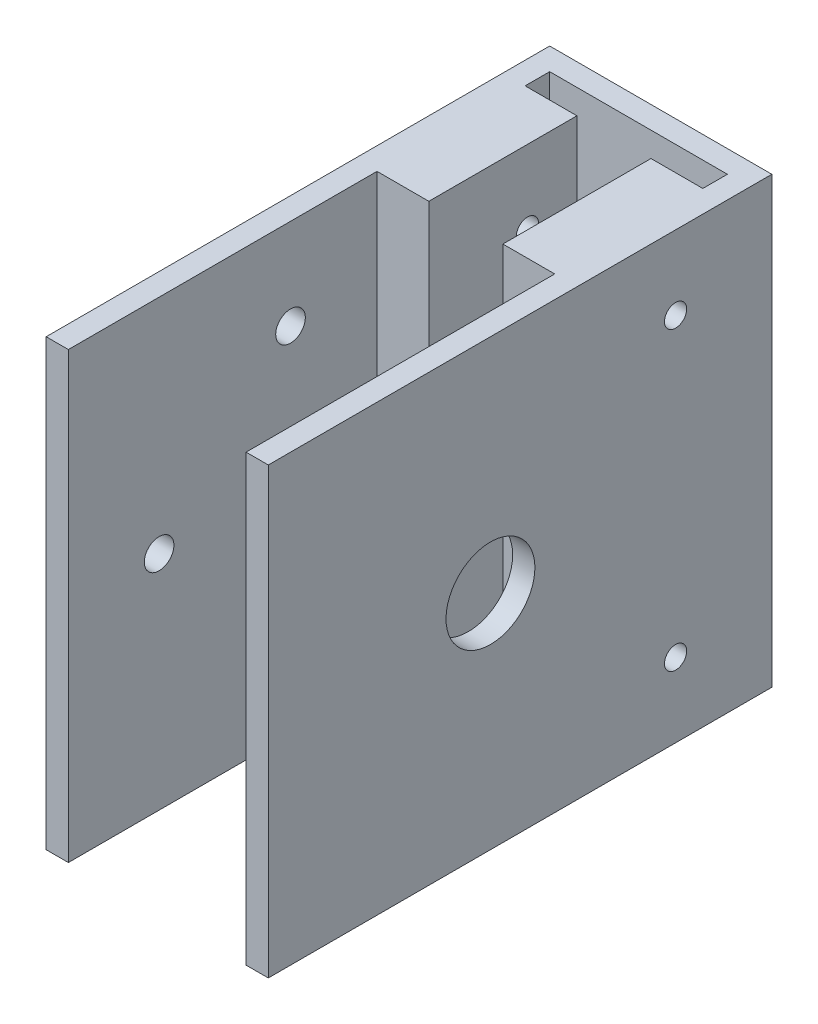
ISO-10303-21;
HEADER;
FILE_DESCRIPTION(('STEP AP214'),'2;1');
FILE_NAME('part.step','',(''),(''),'','','');
FILE_SCHEMA(('AUTOMOTIVE_DESIGN { 1 0 10303 214 1 1 1 1 }'));
ENDSEC;
DATA;
#1=APPLICATION_CONTEXT('core data for automotive mechanical design processes');
#2=APPLICATION_PROTOCOL_DEFINITION('international standard','automotive_design',2000,#1);
#3=PRODUCT_CONTEXT('',#1,'mechanical');
#4=PRODUCT('Part','Part','',(#3));
#5=PRODUCT_RELATED_PRODUCT_CATEGORY('part','',(#4));
#6=PRODUCT_DEFINITION_FORMATION('','',#4);
#7=PRODUCT_DEFINITION_CONTEXT('part definition',#1,'design');
#8=PRODUCT_DEFINITION('design','',#6,#7);
#9=PRODUCT_DEFINITION_SHAPE('','',#8);
#10=(LENGTH_UNIT() NAMED_UNIT(*) SI_UNIT(.MILLI.,.METRE.));
#11=(NAMED_UNIT(*) PLANE_ANGLE_UNIT() SI_UNIT($,.RADIAN.));
#12=(NAMED_UNIT(*) SI_UNIT($,.STERADIAN.) SOLID_ANGLE_UNIT());
#13=UNCERTAINTY_MEASURE_WITH_UNIT(LENGTH_MEASURE(1.E-05),#10,'distance_accuracy_value','');
#14=(GEOMETRIC_REPRESENTATION_CONTEXT(3) GLOBAL_UNCERTAINTY_ASSIGNED_CONTEXT((#13)) GLOBAL_UNIT_ASSIGNED_CONTEXT((#10,
#11,#12)) REPRESENTATION_CONTEXT('',''));
#15=CARTESIAN_POINT('',(0.,0.,0.));
#16=DIRECTION('',(0.,0.,1.));
#17=DIRECTION('',(1.,0.,0.));
#18=AXIS2_PLACEMENT_3D('',#15,#16,#17);
#19=CARTESIAN_POINT('',(-12.,30.,68.));
#20=DIRECTION('',(-1.,0.,0.));
#21=DIRECTION('',(0.,-1.,0.));
#22=AXIS2_PLACEMENT_3D('',#19,#20,#21);
#23=PLANE('',#22);
#24=DIRECTION('',(0.,1.,0.));
#25=VECTOR('',#24,1.);
#26=CARTESIAN_POINT('',(-12.,-51.1896201004171,6.32013899553956));
#27=LINE('',#26,#25);
#28=CARTESIAN_POINT('',(-12.,-30.,6.32013899553956));
#29=VERTEX_POINT('',#28);
#30=CARTESIAN_POINT('',(-12.,30.,6.32013899553956));
#31=VERTEX_POINT('',#30);
#32=EDGE_CURVE('E163',#29,#31,#27,.T.);
#33=ORIENTED_EDGE('',*,*,#32,.F.);
#34=DIRECTION('',(0.,0.,-1.));
#35=VECTOR('',#34,1.);
#36=CARTESIAN_POINT('',(-12.,-30.,68.));
#37=LINE('',#36,#35);
#38=CARTESIAN_POINT('',(-12.,-30.,3.));
#39=VERTEX_POINT('',#38);
#40=EDGE_CURVE('E251',#29,#39,#37,.T.);
#41=ORIENTED_EDGE('',*,*,#40,.T.);
#42=DIRECTION('',(0.,1.,0.));
#43=VECTOR('',#42,1.);
#44=CARTESIAN_POINT('',(-12.,30.,3.));
#45=LINE('',#44,#43);
#46=CARTESIAN_POINT('',(-12.,30.,3.));
#47=VERTEX_POINT('',#46);
#48=EDGE_CURVE('E237',#39,#47,#45,.T.);
#49=ORIENTED_EDGE('',*,*,#48,.T.);
#50=DIRECTION('',(0.,0.,-1.));
#51=VECTOR('',#50,1.);
#52=CARTESIAN_POINT('',(-12.,30.,68.));
#53=LINE('',#52,#51);
#54=EDGE_CURVE('E60',#31,#47,#53,.T.);
#55=ORIENTED_EDGE('',*,*,#54,.F.);
#56=EDGE_LOOP('',(#33,#41,#49,#55));
#57=FACE_BOUND('',#56,.T.);
#58=ADVANCED_FACE('F37',(#57),#23,.F.);
#59=CARTESIAN_POINT('',(12.,30.,68.));
#60=DIRECTION('',(1.,0.,0.));
#61=DIRECTION('',(0.,1.,0.));
#62=AXIS2_PLACEMENT_3D('',#59,#60,#61);
#63=PLANE('',#62);
#64=CARTESIAN_POINT('',(12.,0.,38.));
#65=DIRECTION('',(1.,0.,0.));
#66=DIRECTION('',(0.,1.,0.));
#67=AXIS2_PLACEMENT_3D('',#64,#65,#66);
#68=CIRCLE('',#67,6.00000000000001);
#69=CARTESIAN_POINT('',(12.,6.00000000000001,38.));
#70=VERTEX_POINT('',#69);
#71=EDGE_CURVE('E348',#70,#70,#68,.T.);
#72=ORIENTED_EDGE('',*,*,#71,.T.);
#73=EDGE_LOOP('',(#72));
#74=FACE_BOUND('',#73,.T.);
#75=DIRECTION('',(0.,1.,0.));
#76=VECTOR('',#75,1.);
#77=CARTESIAN_POINT('',(12.,-51.1896201004171,26.3201389955396));
#78=LINE('',#77,#76);
#79=CARTESIAN_POINT('',(12.,-30.,26.3201389955396));
#80=VERTEX_POINT('',#79);
#81=CARTESIAN_POINT('',(12.,30.,26.3201389955396));
#82=VERTEX_POINT('',#81);
#83=EDGE_CURVE('E210',#80,#82,#78,.T.);
#84=ORIENTED_EDGE('',*,*,#83,.F.);
#85=DIRECTION('',(0.,0.,-1.));
#86=VECTOR('',#85,1.);
#87=CARTESIAN_POINT('',(12.,-30.,68.));
#88=LINE('',#87,#86);
#89=CARTESIAN_POINT('',(12.,-30.,68.));
#90=VERTEX_POINT('',#89);
#91=EDGE_CURVE('E230',#90,#80,#88,.T.);
#92=ORIENTED_EDGE('',*,*,#91,.F.);
#93=DIRECTION('',(0.,-1.,0.));
#94=VECTOR('',#93,1.);
#95=CARTESIAN_POINT('',(12.,30.,68.));
#96=LINE('',#95,#94);
#97=CARTESIAN_POINT('',(12.,30.,68.));
#98=VERTEX_POINT('',#97);
#99=EDGE_CURVE('E222',#98,#90,#96,.T.);
#100=ORIENTED_EDGE('',*,*,#99,.F.);
#101=DIRECTION('',(0.,0.,-1.));
#102=VECTOR('',#101,1.);
#103=CARTESIAN_POINT('',(12.,30.,68.));
#104=LINE('',#103,#102);
#105=EDGE_CURVE('E234',#98,#82,#104,.T.);
#106=ORIENTED_EDGE('',*,*,#105,.T.);
#107=EDGE_LOOP('',(#84,#92,#100,#106));
#108=FACE_BOUND('',#107,.T.);
#109=ADVANCED_FACE('F311',(#74,#108),#63,.F.);
#110=CARTESIAN_POINT('',(0.,0.,3.));
#111=DIRECTION('',(0.,0.,1.));
#112=DIRECTION('',(1.,0.,0.));
#113=AXIS2_PLACEMENT_3D('',#110,#111,#112);
#114=PLANE('',#113);
#115=CARTESIAN_POINT('',(0.,15.,3.));
#116=DIRECTION('',(0.,0.,1.));
#117=DIRECTION('',(1.,0.,0.));
#118=AXIS2_PLACEMENT_3D('',#115,#116,#117);
#119=CIRCLE('',#118,2.9);
#120=CARTESIAN_POINT('',(2.9,15.,3.));
#121=VERTEX_POINT('',#120);
#122=EDGE_CURVE('E260',#121,#121,#119,.T.);
#123=ORIENTED_EDGE('',*,*,#122,.F.);
#124=EDGE_LOOP('',(#123));
#125=FACE_BOUND('',#124,.T.);
#126=CARTESIAN_POINT('',(0.,-15.,3.));
#127=DIRECTION('',(0.,0.,1.));
#128=DIRECTION('',(-1.,0.,0.));
#129=AXIS2_PLACEMENT_3D('',#126,#127,#128);
#130=CIRCLE('',#129,2.9);
#131=CARTESIAN_POINT('',(-2.9,-15.,3.));
#132=VERTEX_POINT('',#131);
#133=EDGE_CURVE('E254',#132,#132,#130,.T.);
#134=ORIENTED_EDGE('',*,*,#133,.F.);
#135=EDGE_LOOP('',(#134));
#136=FACE_BOUND('',#135,.T.);
#137=DIRECTION('',(1.,0.,0.));
#138=VECTOR('',#137,1.);
#139=CARTESIAN_POINT('',(-15.,-30.,3.));
#140=LINE('',#139,#138);
#141=CARTESIAN_POINT('',(12.,-30.,3.));
#142=VERTEX_POINT('',#141);
#143=EDGE_CURVE('E269',#39,#142,#140,.T.);
#144=ORIENTED_EDGE('',*,*,#143,.T.);
#145=DIRECTION('',(0.,-1.,0.));
#146=VECTOR('',#145,1.);
#147=CARTESIAN_POINT('',(12.,30.,3.));
#148=LINE('',#147,#146);
#149=CARTESIAN_POINT('',(12.,30.,3.));
#150=VERTEX_POINT('',#149);
#151=EDGE_CURVE('E216',#150,#142,#148,.T.);
#152=ORIENTED_EDGE('',*,*,#151,.F.);
#153=DIRECTION('',(-1.,0.,0.));
#154=VECTOR('',#153,1.);
#155=CARTESIAN_POINT('',(-15.,30.,3.));
#156=LINE('',#155,#154);
#157=EDGE_CURVE('E266',#150,#47,#156,.T.);
#158=ORIENTED_EDGE('',*,*,#157,.T.);
#159=ORIENTED_EDGE('',*,*,#48,.F.);
#160=EDGE_LOOP('',(#144,#152,#158,#159));
#161=FACE_BOUND('',#160,.T.);
#162=ADVANCED_FACE('F331',(#125,#136,#161),#114,.T.);
#163=CARTESIAN_POINT('',(0.,0.,0.));
#164=DIRECTION('',(0.,0.,1.));
#165=DIRECTION('',(1.,0.,0.));
#166=AXIS2_PLACEMENT_3D('',#163,#164,#165);
#167=PLANE('',#166);
#168=DIRECTION('',(0.,1.,0.));
#169=VECTOR('',#168,1.);
#170=CARTESIAN_POINT('',(15.,30.,0.));
#171=LINE('',#170,#169);
#172=CARTESIAN_POINT('',(15.,-30.,0.));
#173=VERTEX_POINT('',#172);
#174=CARTESIAN_POINT('',(15.,30.,0.));
#175=VERTEX_POINT('',#174);
#176=EDGE_CURVE('E263',#173,#175,#171,.T.);
#177=ORIENTED_EDGE('',*,*,#176,.F.);
#178=DIRECTION('',(1.,0.,0.));
#179=VECTOR('',#178,1.);
#180=CARTESIAN_POINT('',(-15.,-30.,0.));
#181=LINE('',#180,#179);
#182=CARTESIAN_POINT('',(-15.,-30.,0.));
#183=VERTEX_POINT('',#182);
#184=EDGE_CURVE('E270',#183,#173,#181,.T.);
#185=ORIENTED_EDGE('',*,*,#184,.F.);
#186=DIRECTION('',(0.,-1.,0.));
#187=VECTOR('',#186,1.);
#188=CARTESIAN_POINT('',(-15.,30.,0.));
#189=LINE('',#188,#187);
#190=CARTESIAN_POINT('',(-15.,30.,0.));
#191=VERTEX_POINT('',#190);
#192=EDGE_CURVE('E278',#191,#183,#189,.T.);
#193=ORIENTED_EDGE('',*,*,#192,.F.);
#194=DIRECTION('',(-1.,0.,0.));
#195=VECTOR('',#194,1.);
#196=CARTESIAN_POINT('',(-15.,30.,0.));
#197=LINE('',#196,#195);
#198=EDGE_CURVE('E276',#175,#191,#197,.T.);
#199=ORIENTED_EDGE('',*,*,#198,.F.);
#200=EDGE_LOOP('',(#177,#185,#193,#199));
#201=FACE_BOUND('',#200,.T.);
#202=CARTESIAN_POINT('',(0.,15.,0.));
#203=DIRECTION('',(0.,0.,1.));
#204=DIRECTION('',(1.,0.,0.));
#205=AXIS2_PLACEMENT_3D('',#202,#203,#204);
#206=CIRCLE('',#205,2.9);
#207=CARTESIAN_POINT('',(2.9,15.,0.));
#208=VERTEX_POINT('',#207);
#209=EDGE_CURVE('E257',#208,#208,#206,.T.);
#210=ORIENTED_EDGE('',*,*,#209,.T.);
#211=EDGE_LOOP('',(#210));
#212=FACE_BOUND('',#211,.T.);
#213=CARTESIAN_POINT('',(0.,-15.,0.));
#214=DIRECTION('',(0.,0.,1.));
#215=DIRECTION('',(-1.,0.,0.));
#216=AXIS2_PLACEMENT_3D('',#213,#214,#215);
#217=CIRCLE('',#216,2.9);
#218=CARTESIAN_POINT('',(-2.9,-15.,0.));
#219=VERTEX_POINT('',#218);
#220=EDGE_CURVE('E253',#219,#219,#217,.T.);
#221=ORIENTED_EDGE('',*,*,#220,.T.);
#222=EDGE_LOOP('',(#221));
#223=FACE_BOUND('',#222,.T.);
#224=ADVANCED_FACE('F294',(#201,#212,#223),#167,.F.);
#225=CARTESIAN_POINT('',(15.,30.,3.));
#226=DIRECTION('',(-1.,0.,0.));
#227=DIRECTION('',(0.,-1.,0.));
#228=AXIS2_PLACEMENT_3D('',#225,#226,#227);
#229=PLANE('',#228);
#230=CARTESIAN_POINT('',(15.,-20.,13.));
#231=DIRECTION('',(-1.,0.,0.));
#232=DIRECTION('',(0.,-1.,0.));
#233=AXIS2_PLACEMENT_3D('',#230,#231,#232);
#234=CIRCLE('',#233,1.5);
#235=CARTESIAN_POINT('',(15.,-21.5,13.));
#236=VERTEX_POINT('',#235);
#237=EDGE_CURVE('E385',#236,#236,#234,.T.);
#238=ORIENTED_EDGE('',*,*,#237,.T.);
#239=EDGE_LOOP('',(#238));
#240=FACE_BOUND('',#239,.T.);
#241=CARTESIAN_POINT('',(15.,20.,13.));
#242=DIRECTION('',(-1.,0.,0.));
#243=DIRECTION('',(0.,-1.,0.));
#244=AXIS2_PLACEMENT_3D('',#241,#242,#243);
#245=CIRCLE('',#244,1.5);
#246=CARTESIAN_POINT('',(15.,18.5,13.));
#247=VERTEX_POINT('',#246);
#248=EDGE_CURVE('E389',#247,#247,#245,.T.);
#249=ORIENTED_EDGE('',*,*,#248,.T.);
#250=EDGE_LOOP('',(#249));
#251=FACE_BOUND('',#250,.T.);
#252=CARTESIAN_POINT('',(15.,0.,38.));
#253=DIRECTION('',(-1.,0.,0.));
#254=DIRECTION('',(0.,-1.,0.));
#255=AXIS2_PLACEMENT_3D('',#252,#253,#254);
#256=CIRCLE('',#255,6.00000000000001);
#257=CARTESIAN_POINT('',(15.,-6.00000000000001,38.));
#258=VERTEX_POINT('',#257);
#259=EDGE_CURVE('E386',#258,#258,#256,.T.);
#260=ORIENTED_EDGE('',*,*,#259,.T.);
#261=EDGE_LOOP('',(#260));
#262=FACE_BOUND('',#261,.T.);
#263=ORIENTED_EDGE('',*,*,#176,.T.);
#264=DIRECTION('',(0.,0.,-1.));
#265=VECTOR('',#264,1.);
#266=CARTESIAN_POINT('',(15.,30.,3.));
#267=LINE('',#266,#265);
#268=CARTESIAN_POINT('',(15.,30.,68.));
#269=VERTEX_POINT('',#268);
#270=EDGE_CURVE('E11',#269,#175,#267,.T.);
#271=ORIENTED_EDGE('',*,*,#270,.F.);
#272=DIRECTION('',(0.,1.,0.));
#273=VECTOR('',#272,1.);
#274=CARTESIAN_POINT('',(15.,30.,68.));
#275=LINE('',#274,#273);
#276=CARTESIAN_POINT('',(15.,-30.,68.));
#277=VERTEX_POINT('',#276);
#278=EDGE_CURVE('E217',#277,#269,#275,.T.);
#279=ORIENTED_EDGE('',*,*,#278,.F.);
#280=DIRECTION('',(0.,0.,-1.));
#281=VECTOR('',#280,1.);
#282=CARTESIAN_POINT('',(15.,-30.,3.));
#283=LINE('',#282,#281);
#284=EDGE_CURVE('E273',#277,#173,#283,.T.);
#285=ORIENTED_EDGE('',*,*,#284,.T.);
#286=EDGE_LOOP('',(#263,#271,#279,#285));
#287=FACE_BOUND('',#286,.T.);
#288=ADVANCED_FACE('F39',(#240,#251,#262,#287),#229,.F.);
#289=CARTESIAN_POINT('',(-15.,30.,3.));
#290=DIRECTION('',(0.,-1.,0.));
#291=DIRECTION('',(0.,0.,-1.));
#292=AXIS2_PLACEMENT_3D('',#289,#290,#291);
#293=PLANE('',#292);
#294=ORIENTED_EDGE('',*,*,#198,.T.);
#295=DIRECTION('',(0.,0.,-1.));
#296=VECTOR('',#295,1.);
#297=CARTESIAN_POINT('',(-15.,30.,3.));
#298=LINE('',#297,#296);
#299=CARTESIAN_POINT('',(-15.,30.,68.));
#300=VERTEX_POINT('',#299);
#301=EDGE_CURVE('E45',#300,#191,#298,.T.);
#302=ORIENTED_EDGE('',*,*,#301,.F.);
#303=DIRECTION('',(-1.,0.,0.));
#304=VECTOR('',#303,1.);
#305=CARTESIAN_POINT('',(-15.,30.,68.));
#306=LINE('',#305,#304);
#307=CARTESIAN_POINT('',(-12.,30.,68.));
#308=VERTEX_POINT('',#307);
#309=EDGE_CURVE('E245',#308,#300,#306,.T.);
#310=ORIENTED_EDGE('',*,*,#309,.F.);
#311=CARTESIAN_POINT('',(-12.,30.,26.3201389955396));
#312=VERTEX_POINT('',#311);
#313=EDGE_CURVE('E249',#308,#312,#53,.T.);
#314=ORIENTED_EDGE('',*,*,#313,.T.);
#315=DIRECTION('',(1.,0.,0.));
#316=VECTOR('',#315,1.);
#317=CARTESIAN_POINT('',(0.,30.,26.3201389955396));
#318=LINE('',#317,#316);
#319=CARTESIAN_POINT('',(-5.,30.,26.3201389955396));
#320=VERTEX_POINT('',#319);
#321=EDGE_CURVE('E164',#312,#320,#318,.T.);
#322=ORIENTED_EDGE('',*,*,#321,.T.);
#323=DIRECTION('',(0.,0.,1.));
#324=VECTOR('',#323,1.);
#325=CARTESIAN_POINT('',(-5.,30.,0.));
#326=LINE('',#325,#324);
#327=CARTESIAN_POINT('',(-5.,30.,6.32013899553957));
#328=VERTEX_POINT('',#327);
#329=EDGE_CURVE('E158',#328,#320,#326,.T.);
#330=ORIENTED_EDGE('',*,*,#329,.F.);
#331=DIRECTION('',(1.,0.,0.));
#332=VECTOR('',#331,1.);
#333=CARTESIAN_POINT('',(0.,30.,6.32013899553957));
#334=LINE('',#333,#332);
#335=EDGE_CURVE('E167',#31,#328,#334,.T.);
#336=ORIENTED_EDGE('',*,*,#335,.F.);
#337=ORIENTED_EDGE('',*,*,#54,.T.);
#338=ORIENTED_EDGE('',*,*,#157,.F.);
#339=CARTESIAN_POINT('',(12.,30.,6.32013899553956));
#340=VERTEX_POINT('',#339);
#341=EDGE_CURVE('E233',#340,#150,#104,.T.);
#342=ORIENTED_EDGE('',*,*,#341,.F.);
#343=DIRECTION('',(-1.,0.,0.));
#344=VECTOR('',#343,1.);
#345=CARTESIAN_POINT('',(0.,30.,6.32013899553957));
#346=LINE('',#345,#344);
#347=CARTESIAN_POINT('',(5.,30.,6.32013899553957));
#348=VERTEX_POINT('',#347);
#349=EDGE_CURVE('E198',#340,#348,#346,.T.);
#350=ORIENTED_EDGE('',*,*,#349,.T.);
#351=DIRECTION('',(0.,0.,1.));
#352=VECTOR('',#351,1.);
#353=CARTESIAN_POINT('',(5.,30.,0.));
#354=LINE('',#353,#352);
#355=CARTESIAN_POINT('',(5.,30.,26.3201389955396));
#356=VERTEX_POINT('',#355);
#357=EDGE_CURVE('E201',#348,#356,#354,.T.);
#358=ORIENTED_EDGE('',*,*,#357,.T.);
#359=DIRECTION('',(-1.,0.,0.));
#360=VECTOR('',#359,1.);
#361=CARTESIAN_POINT('',(0.,30.,26.3201389955396));
#362=LINE('',#361,#360);
#363=EDGE_CURVE('E204',#82,#356,#362,.T.);
#364=ORIENTED_EDGE('',*,*,#363,.F.);
#365=ORIENTED_EDGE('',*,*,#105,.F.);
#366=DIRECTION('',(-1.,0.,0.));
#367=VECTOR('',#366,1.);
#368=CARTESIAN_POINT('',(15.,30.,68.));
#369=LINE('',#368,#367);
#370=EDGE_CURVE('E220',#269,#98,#369,.T.);
#371=ORIENTED_EDGE('',*,*,#370,.F.);
#372=ORIENTED_EDGE('',*,*,#270,.T.);
#373=EDGE_LOOP('',(#294,#302,#310,#314,#322,#330,#336,#337,#338,#342,#350,#358,#364,#365,#371,#372));
#374=FACE_BOUND('',#373,.T.);
#375=ADVANCED_FACE('F171',(#374),#293,.F.);
#376=CARTESIAN_POINT('',(-15.,30.,3.));
#377=DIRECTION('',(1.,0.,0.));
#378=DIRECTION('',(0.,1.,0.));
#379=AXIS2_PLACEMENT_3D('',#376,#377,#378);
#380=PLANE('',#379);
#381=CARTESIAN_POINT('',(-15.,-20.,13.));
#382=DIRECTION('',(-1.,0.,0.));
#383=DIRECTION('',(0.,1.,0.));
#384=AXIS2_PLACEMENT_3D('',#381,#382,#383);
#385=CIRCLE('',#384,1.5);
#386=CARTESIAN_POINT('',(-15.,-18.5,13.));
#387=VERTEX_POINT('',#386);
#388=EDGE_CURVE('E345',#387,#387,#385,.T.);
#389=ORIENTED_EDGE('',*,*,#388,.F.);
#390=EDGE_LOOP('',(#389));
#391=FACE_BOUND('',#390,.T.);
#392=CARTESIAN_POINT('',(-15.,-17.75,37.9999999999998));
#393=DIRECTION('',(-1.,0.,0.));
#394=DIRECTION('',(0.,-1.,0.));
#395=AXIS2_PLACEMENT_3D('',#392,#393,#394);
#396=CIRCLE('',#395,2.);
#397=CARTESIAN_POINT('',(-15.,-19.75,37.9999999999998));
#398=VERTEX_POINT('',#397);
#399=EDGE_CURVE('E349',#398,#398,#396,.T.);
#400=ORIENTED_EDGE('',*,*,#399,.F.);
#401=EDGE_LOOP('',(#400));
#402=FACE_BOUND('',#401,.T.);
#403=CARTESIAN_POINT('',(-15.,0.,38.));
#404=DIRECTION('',(-1.,0.,0.));
#405=DIRECTION('',(0.,-1.,0.));
#406=AXIS2_PLACEMENT_3D('',#403,#404,#405);
#407=CIRCLE('',#406,6.00000000000001);
#408=CARTESIAN_POINT('',(-15.,-6.00000000000001,38.));
#409=VERTEX_POINT('',#408);
#410=EDGE_CURVE('E340',#409,#409,#407,.T.);
#411=ORIENTED_EDGE('',*,*,#410,.F.);
#412=EDGE_LOOP('',(#411));
#413=FACE_BOUND('',#412,.T.);
#414=CARTESIAN_POINT('',(-15.,0.,20.25));
#415=DIRECTION('',(-1.,0.,0.));
#416=DIRECTION('',(0.,-1.,0.));
#417=AXIS2_PLACEMENT_3D('',#414,#415,#416);
#418=CIRCLE('',#417,2.);
#419=CARTESIAN_POINT('',(-15.,-2.,20.25));
#420=VERTEX_POINT('',#419);
#421=EDGE_CURVE('E359',#420,#420,#418,.T.);
#422=ORIENTED_EDGE('',*,*,#421,.F.);
#423=EDGE_LOOP('',(#422));
#424=FACE_BOUND('',#423,.T.);
#425=CARTESIAN_POINT('',(-15.,17.75,38.0000000000001));
#426=DIRECTION('',(-1.,0.,0.));
#427=DIRECTION('',(0.,-1.,0.));
#428=AXIS2_PLACEMENT_3D('',#425,#426,#427);
#429=CIRCLE('',#428,2.);
#430=CARTESIAN_POINT('',(-15.,15.75,38.0000000000001));
#431=VERTEX_POINT('',#430);
#432=EDGE_CURVE('E362',#431,#431,#429,.T.);
#433=ORIENTED_EDGE('',*,*,#432,.F.);
#434=EDGE_LOOP('',(#433));
#435=FACE_BOUND('',#434,.T.);
#436=CARTESIAN_POINT('',(-15.,-1.25682311004908E-13,55.75));
#437=DIRECTION('',(-1.,0.,0.));
#438=DIRECTION('',(0.,-1.,0.));
#439=AXIS2_PLACEMENT_3D('',#436,#437,#438);
#440=CIRCLE('',#439,2.);
#441=CARTESIAN_POINT('',(-15.,-2.00000000000012,55.75));
#442=VERTEX_POINT('',#441);
#443=EDGE_CURVE('E367',#442,#442,#440,.T.);
#444=ORIENTED_EDGE('',*,*,#443,.F.);
#445=EDGE_LOOP('',(#444));
#446=FACE_BOUND('',#445,.T.);
#447=CARTESIAN_POINT('',(-15.,20.,13.));
#448=DIRECTION('',(-1.,0.,0.));
#449=DIRECTION('',(0.,-1.,0.));
#450=AXIS2_PLACEMENT_3D('',#447,#448,#449);
#451=CIRCLE('',#450,1.5);
#452=CARTESIAN_POINT('',(-15.,18.5,13.));
#453=VERTEX_POINT('',#452);
#454=EDGE_CURVE('E177',#453,#453,#451,.T.);
#455=ORIENTED_EDGE('',*,*,#454,.F.);
#456=EDGE_LOOP('',(#455));
#457=FACE_BOUND('',#456,.T.);
#458=ORIENTED_EDGE('',*,*,#192,.T.);
#459=DIRECTION('',(0.,0.,-1.));
#460=VECTOR('',#459,1.);
#461=CARTESIAN_POINT('',(-15.,-30.,3.));
#462=LINE('',#461,#460);
#463=CARTESIAN_POINT('',(-15.,-30.,68.));
#464=VERTEX_POINT('',#463);
#465=EDGE_CURVE('E283',#464,#183,#462,.T.);
#466=ORIENTED_EDGE('',*,*,#465,.F.);
#467=DIRECTION('',(0.,-1.,0.));
#468=VECTOR('',#467,1.);
#469=CARTESIAN_POINT('',(-15.,30.,68.));
#470=LINE('',#469,#468);
#471=EDGE_CURVE('E238',#300,#464,#470,.T.);
#472=ORIENTED_EDGE('',*,*,#471,.F.);
#473=ORIENTED_EDGE('',*,*,#301,.T.);
#474=EDGE_LOOP('',(#458,#466,#472,#473));
#475=FACE_BOUND('',#474,.T.);
#476=ADVANCED_FACE('F289',(#391,#402,#413,#424,#435,#446,#457,#475),#380,.F.);
#477=CARTESIAN_POINT('',(-15.,-30.,3.));
#478=DIRECTION('',(0.,1.,0.));
#479=DIRECTION('',(0.,0.,1.));
#480=AXIS2_PLACEMENT_3D('',#477,#478,#479);
#481=PLANE('',#480);
#482=ORIENTED_EDGE('',*,*,#184,.T.);
#483=ORIENTED_EDGE('',*,*,#284,.F.);
#484=DIRECTION('',(1.,0.,0.));
#485=VECTOR('',#484,1.);
#486=CARTESIAN_POINT('',(15.,-30.,68.));
#487=LINE('',#486,#485);
#488=EDGE_CURVE('E224',#90,#277,#487,.T.);
#489=ORIENTED_EDGE('',*,*,#488,.F.);
#490=ORIENTED_EDGE('',*,*,#91,.T.);
#491=DIRECTION('',(1.,0.,0.));
#492=VECTOR('',#491,1.);
#493=CARTESIAN_POINT('',(0.,-30.,26.3201389955396));
#494=LINE('',#493,#492);
#495=CARTESIAN_POINT('',(5.,-30.,26.3201389955396));
#496=VERTEX_POINT('',#495);
#497=EDGE_CURVE('E191',#496,#80,#494,.T.);
#498=ORIENTED_EDGE('',*,*,#497,.F.);
#499=DIRECTION('',(0.,0.,-1.));
#500=VECTOR('',#499,1.);
#501=CARTESIAN_POINT('',(5.,-30.,0.));
#502=LINE('',#501,#500);
#503=CARTESIAN_POINT('',(5.,-30.,6.32013899553957));
#504=VERTEX_POINT('',#503);
#505=EDGE_CURVE('E197',#496,#504,#502,.T.);
#506=ORIENTED_EDGE('',*,*,#505,.T.);
#507=DIRECTION('',(1.,0.,0.));
#508=VECTOR('',#507,1.);
#509=CARTESIAN_POINT('',(0.,-30.,6.32013899553957));
#510=LINE('',#509,#508);
#511=CARTESIAN_POINT('',(12.,-30.,6.32013899553956));
#512=VERTEX_POINT('',#511);
#513=EDGE_CURVE('E193',#504,#512,#510,.T.);
#514=ORIENTED_EDGE('',*,*,#513,.T.);
#515=EDGE_CURVE('E227',#512,#142,#88,.T.);
#516=ORIENTED_EDGE('',*,*,#515,.T.);
#517=ORIENTED_EDGE('',*,*,#143,.F.);
#518=ORIENTED_EDGE('',*,*,#40,.F.);
#519=DIRECTION('',(-1.,0.,0.));
#520=VECTOR('',#519,1.);
#521=CARTESIAN_POINT('',(0.,-30.,6.32013899553957));
#522=LINE('',#521,#520);
#523=CARTESIAN_POINT('',(-5.,-30.,6.32013899553957));
#524=VERTEX_POINT('',#523);
#525=EDGE_CURVE('E185',#524,#29,#522,.T.);
#526=ORIENTED_EDGE('',*,*,#525,.F.);
#527=DIRECTION('',(0.,0.,-1.));
#528=VECTOR('',#527,1.);
#529=CARTESIAN_POINT('',(-5.,-30.,0.));
#530=LINE('',#529,#528);
#531=CARTESIAN_POINT('',(-5.,-30.,26.3201389955396));
#532=VERTEX_POINT('',#531);
#533=EDGE_CURVE('E160',#532,#524,#530,.T.);
#534=ORIENTED_EDGE('',*,*,#533,.F.);
#535=DIRECTION('',(-1.,0.,0.));
#536=VECTOR('',#535,1.);
#537=CARTESIAN_POINT('',(0.,-30.,26.3201389955396));
#538=LINE('',#537,#536);
#539=CARTESIAN_POINT('',(-12.,-30.,26.3201389955396));
#540=VERTEX_POINT('',#539);
#541=EDGE_CURVE('E190',#532,#540,#538,.T.);
#542=ORIENTED_EDGE('',*,*,#541,.T.);
#543=CARTESIAN_POINT('',(-12.,-30.,68.));
#544=VERTEX_POINT('',#543);
#545=EDGE_CURVE('E52',#544,#540,#37,.T.);
#546=ORIENTED_EDGE('',*,*,#545,.F.);
#547=DIRECTION('',(1.,0.,0.));
#548=VECTOR('',#547,1.);
#549=CARTESIAN_POINT('',(-15.,-30.,68.));
#550=LINE('',#549,#548);
#551=EDGE_CURVE('E241',#464,#544,#550,.T.);
#552=ORIENTED_EDGE('',*,*,#551,.F.);
#553=ORIENTED_EDGE('',*,*,#465,.T.);
#554=EDGE_LOOP('',(#482,#483,#489,#490,#498,#506,#514,#516,#517,#518,#526,#534,#542,#546,#552,#553));
#555=FACE_BOUND('',#554,.T.);
#556=ADVANCED_FACE('F297',(#555),#481,.F.);
#557=CARTESIAN_POINT('',(0.,15.,3.));
#558=DIRECTION('',(0.,0.,-1.));
#559=DIRECTION('',(-1.,0.,0.));
#560=AXIS2_PLACEMENT_3D('',#557,#558,#559);
#561=CYLINDRICAL_SURFACE('',#560,2.9);
#562=ORIENTED_EDGE('',*,*,#122,.T.);
#563=EDGE_LOOP('',(#562));
#564=FACE_BOUND('',#563,.T.);
#565=ORIENTED_EDGE('',*,*,#209,.F.);
#566=EDGE_LOOP('',(#565));
#567=FACE_BOUND('',#566,.T.);
#568=ADVANCED_FACE('F431',(#564,#567),#561,.F.);
#569=CARTESIAN_POINT('',(0.,-15.,3.));
#570=DIRECTION('',(0.,0.,-1.));
#571=DIRECTION('',(-1.,0.,0.));
#572=AXIS2_PLACEMENT_3D('',#569,#570,#571);
#573=CYLINDRICAL_SURFACE('',#572,2.9);
#574=ORIENTED_EDGE('',*,*,#133,.T.);
#575=EDGE_LOOP('',(#574));
#576=FACE_BOUND('',#575,.T.);
#577=ORIENTED_EDGE('',*,*,#220,.F.);
#578=EDGE_LOOP('',(#577));
#579=FACE_BOUND('',#578,.T.);
#580=ADVANCED_FACE('F424',(#576,#579),#573,.F.);
#581=CARTESIAN_POINT('',(-12.,-17.75,37.9999999999998));
#582=DIRECTION('',(-1.,0.,0.));
#583=DIRECTION('',(0.,-1.,0.));
#584=AXIS2_PLACEMENT_3D('',#581,#582,#583);
#585=CIRCLE('',#584,2.);
#586=CARTESIAN_POINT('',(-12.,-19.75,37.9999999999998));
#587=VERTEX_POINT('',#586);
#588=EDGE_CURVE('E344',#587,#587,#585,.F.);
#589=ORIENTED_EDGE('',*,*,#588,.F.);
#590=EDGE_LOOP('',(#589));
#591=FACE_BOUND('',#590,.T.);
#592=CARTESIAN_POINT('',(-12.,0.,38.));
#593=DIRECTION('',(-1.,0.,0.));
#594=DIRECTION('',(0.,-1.,0.));
#595=AXIS2_PLACEMENT_3D('',#592,#593,#594);
#596=CIRCLE('',#595,6.00000000000001);
#597=CARTESIAN_POINT('',(-12.,-6.00000000000001,38.));
#598=VERTEX_POINT('',#597);
#599=EDGE_CURVE('E358',#598,#598,#596,.F.);
#600=ORIENTED_EDGE('',*,*,#599,.F.);
#601=EDGE_LOOP('',(#600));
#602=FACE_BOUND('',#601,.T.);
#603=CARTESIAN_POINT('',(-12.,17.75,38.0000000000001));
#604=DIRECTION('',(-1.,0.,0.));
#605=DIRECTION('',(0.,-1.,0.));
#606=AXIS2_PLACEMENT_3D('',#603,#604,#605);
#607=CIRCLE('',#606,2.);
#608=CARTESIAN_POINT('',(-12.,15.75,38.0000000000001));
#609=VERTEX_POINT('',#608);
#610=EDGE_CURVE('E370',#609,#609,#607,.F.);
#611=ORIENTED_EDGE('',*,*,#610,.F.);
#612=EDGE_LOOP('',(#611));
#613=FACE_BOUND('',#612,.T.);
#614=CARTESIAN_POINT('',(-12.,-1.25335366309713E-13,55.75));
#615=DIRECTION('',(-1.,0.,0.));
#616=DIRECTION('',(0.,-1.,0.));
#617=AXIS2_PLACEMENT_3D('',#614,#615,#616);
#618=CIRCLE('',#617,2.);
#619=CARTESIAN_POINT('',(-12.,-2.00000000000012,55.75));
#620=VERTEX_POINT('',#619);
#621=EDGE_CURVE('E352',#620,#620,#618,.F.);
#622=ORIENTED_EDGE('',*,*,#621,.F.);
#623=EDGE_LOOP('',(#622));
#624=FACE_BOUND('',#623,.T.);
#625=ORIENTED_EDGE('',*,*,#545,.T.);
#626=DIRECTION('',(0.,1.,0.));
#627=VECTOR('',#626,1.);
#628=CARTESIAN_POINT('',(-12.,-51.1896201004171,26.3201389955396));
#629=LINE('',#628,#627);
#630=EDGE_CURVE('E186',#540,#312,#629,.T.);
#631=ORIENTED_EDGE('',*,*,#630,.T.);
#632=ORIENTED_EDGE('',*,*,#313,.F.);
#633=DIRECTION('',(0.,1.,0.));
#634=VECTOR('',#633,1.);
#635=CARTESIAN_POINT('',(-12.,30.,68.));
#636=LINE('',#635,#634);
#637=EDGE_CURVE('E243',#544,#308,#636,.T.);
#638=ORIENTED_EDGE('',*,*,#637,.F.);
#639=EDGE_LOOP('',(#625,#631,#632,#638));
#640=FACE_BOUND('',#639,.T.);
#641=ADVANCED_FACE('F414',(#591,#602,#613,#624,#640),#23,.F.);
#642=CARTESIAN_POINT('',(0.,0.,68.));
#643=DIRECTION('',(0.,0.,1.));
#644=DIRECTION('',(1.,0.,0.));
#645=AXIS2_PLACEMENT_3D('',#642,#643,#644);
#646=PLANE('',#645);
#647=ORIENTED_EDGE('',*,*,#471,.T.);
#648=ORIENTED_EDGE('',*,*,#551,.T.);
#649=ORIENTED_EDGE('',*,*,#637,.T.);
#650=ORIENTED_EDGE('',*,*,#309,.T.);
#651=EDGE_LOOP('',(#647,#648,#649,#650));
#652=FACE_BOUND('',#651,.T.);
#653=ADVANCED_FACE('F423',(#652),#646,.T.);
#654=ORIENTED_EDGE('',*,*,#515,.F.);
#655=DIRECTION('',(0.,1.,0.));
#656=VECTOR('',#655,1.);
#657=CARTESIAN_POINT('',(12.,-51.1896201004171,6.32013899553956));
#658=LINE('',#657,#656);
#659=EDGE_CURVE('E194',#512,#340,#658,.T.);
#660=ORIENTED_EDGE('',*,*,#659,.T.);
#661=ORIENTED_EDGE('',*,*,#341,.T.);
#662=ORIENTED_EDGE('',*,*,#151,.T.);
#663=EDGE_LOOP('',(#654,#660,#661,#662));
#664=FACE_BOUND('',#663,.T.);
#665=ADVANCED_FACE('F326',(#664),#63,.F.);
#666=CARTESIAN_POINT('',(0.,0.,68.));
#667=DIRECTION('',(0.,0.,-1.));
#668=DIRECTION('',(-1.,0.,0.));
#669=AXIS2_PLACEMENT_3D('',#666,#667,#668);
#670=PLANE('',#669);
#671=ORIENTED_EDGE('',*,*,#278,.T.);
#672=ORIENTED_EDGE('',*,*,#370,.T.);
#673=ORIENTED_EDGE('',*,*,#99,.T.);
#674=ORIENTED_EDGE('',*,*,#488,.T.);
#675=EDGE_LOOP('',(#671,#672,#673,#674));
#676=FACE_BOUND('',#675,.T.);
#677=ADVANCED_FACE('F304',(#676),#670,.F.);
#678=CARTESIAN_POINT('',(0.,-51.1896201004171,6.32013899553957));
#679=DIRECTION('',(0.,0.,-1.));
#680=DIRECTION('',(-1.,0.,0.));
#681=AXIS2_PLACEMENT_3D('',#678,#679,#680);
#682=PLANE('',#681);
#683=ORIENTED_EDGE('',*,*,#513,.F.);
#684=DIRECTION('',(0.,1.,0.));
#685=VECTOR('',#684,1.);
#686=CARTESIAN_POINT('',(5.,-51.1896201004171,6.32013899553957));
#687=LINE('',#686,#685);
#688=EDGE_CURVE('E207',#504,#348,#687,.T.);
#689=ORIENTED_EDGE('',*,*,#688,.T.);
#690=ORIENTED_EDGE('',*,*,#349,.F.);
#691=ORIENTED_EDGE('',*,*,#659,.F.);
#692=EDGE_LOOP('',(#683,#689,#690,#691));
#693=FACE_BOUND('',#692,.T.);
#694=ADVANCED_FACE('F324',(#693),#682,.T.);
#695=CARTESIAN_POINT('',(0.,-51.1896201004171,26.3201389955396));
#696=DIRECTION('',(0.,0.,-1.));
#697=DIRECTION('',(-1.,0.,0.));
#698=AXIS2_PLACEMENT_3D('',#695,#696,#697);
#699=PLANE('',#698);
#700=DIRECTION('',(0.,1.,0.));
#701=VECTOR('',#700,1.);
#702=CARTESIAN_POINT('',(5.,-51.1896201004171,26.3201389955396));
#703=LINE('',#702,#701);
#704=EDGE_CURVE('E212',#496,#356,#703,.T.);
#705=ORIENTED_EDGE('',*,*,#704,.F.);
#706=ORIENTED_EDGE('',*,*,#497,.T.);
#707=ORIENTED_EDGE('',*,*,#83,.T.);
#708=ORIENTED_EDGE('',*,*,#363,.T.);
#709=EDGE_LOOP('',(#705,#706,#707,#708));
#710=FACE_BOUND('',#709,.T.);
#711=ADVANCED_FACE('F314',(#710),#699,.F.);
#712=CARTESIAN_POINT('',(5.,-51.1896201004171,0.));
#713=DIRECTION('',(-1.,0.,0.));
#714=DIRECTION('',(0.,0.,1.));
#715=AXIS2_PLACEMENT_3D('',#712,#713,#714);
#716=PLANE('',#715);
#717=CARTESIAN_POINT('',(5.,-20.,13.));
#718=DIRECTION('',(-1.,0.,0.));
#719=DIRECTION('',(0.,0.,1.));
#720=AXIS2_PLACEMENT_3D('',#717,#718,#719);
#721=CIRCLE('',#720,1.5);
#722=CARTESIAN_POINT('',(5.,-20.,14.5));
#723=VERTEX_POINT('',#722);
#724=EDGE_CURVE('E379',#723,#723,#721,.T.);
#725=ORIENTED_EDGE('',*,*,#724,.F.);
#726=EDGE_LOOP('',(#725));
#727=FACE_BOUND('',#726,.T.);
#728=CARTESIAN_POINT('',(5.,20.,13.));
#729=DIRECTION('',(-1.,0.,0.));
#730=DIRECTION('',(0.,0.,1.));
#731=AXIS2_PLACEMENT_3D('',#728,#729,#730);
#732=CIRCLE('',#731,1.5);
#733=CARTESIAN_POINT('',(5.,20.,14.5));
#734=VERTEX_POINT('',#733);
#735=EDGE_CURVE('E382',#734,#734,#732,.T.);
#736=ORIENTED_EDGE('',*,*,#735,.F.);
#737=EDGE_LOOP('',(#736));
#738=FACE_BOUND('',#737,.T.);
#739=ORIENTED_EDGE('',*,*,#505,.F.);
#740=ORIENTED_EDGE('',*,*,#704,.T.);
#741=ORIENTED_EDGE('',*,*,#357,.F.);
#742=ORIENTED_EDGE('',*,*,#688,.F.);
#743=EDGE_LOOP('',(#739,#740,#741,#742));
#744=FACE_BOUND('',#743,.T.);
#745=ADVANCED_FACE('F320',(#727,#738,#744),#716,.T.);
#746=CARTESIAN_POINT('',(0.,-51.1896201004171,6.32013899553957));
#747=DIRECTION('',(0.,0.,1.));
#748=DIRECTION('',(1.,0.,0.));
#749=AXIS2_PLACEMENT_3D('',#746,#747,#748);
#750=PLANE('',#749);
#751=DIRECTION('',(0.,1.,0.));
#752=VECTOR('',#751,1.);
#753=CARTESIAN_POINT('',(-5.,-51.1896201004171,6.32013899553957));
#754=LINE('',#753,#752);
#755=EDGE_CURVE('E153',#524,#328,#754,.T.);
#756=ORIENTED_EDGE('',*,*,#755,.F.);
#757=ORIENTED_EDGE('',*,*,#525,.T.);
#758=ORIENTED_EDGE('',*,*,#32,.T.);
#759=ORIENTED_EDGE('',*,*,#335,.T.);
#760=EDGE_LOOP('',(#756,#757,#758,#759));
#761=FACE_BOUND('',#760,.T.);
#762=ADVANCED_FACE('F168',(#761),#750,.F.);
#763=CARTESIAN_POINT('',(0.,-51.1896201004171,26.3201389955396));
#764=DIRECTION('',(0.,0.,1.));
#765=DIRECTION('',(1.,0.,0.));
#766=AXIS2_PLACEMENT_3D('',#763,#764,#765);
#767=PLANE('',#766);
#768=ORIENTED_EDGE('',*,*,#541,.F.);
#769=DIRECTION('',(0.,1.,0.));
#770=VECTOR('',#769,1.);
#771=CARTESIAN_POINT('',(-5.,-51.1896201004171,26.3201389955396));
#772=LINE('',#771,#770);
#773=EDGE_CURVE('E183',#532,#320,#772,.T.);
#774=ORIENTED_EDGE('',*,*,#773,.T.);
#775=ORIENTED_EDGE('',*,*,#321,.F.);
#776=ORIENTED_EDGE('',*,*,#630,.F.);
#777=EDGE_LOOP('',(#768,#774,#775,#776));
#778=FACE_BOUND('',#777,.T.);
#779=ADVANCED_FACE('F336',(#778),#767,.T.);
#780=CARTESIAN_POINT('',(-5.,-51.1896201004171,0.));
#781=DIRECTION('',(-1.,0.,0.));
#782=DIRECTION('',(0.,0.,1.));
#783=AXIS2_PLACEMENT_3D('',#780,#781,#782);
#784=PLANE('',#783);
#785=CARTESIAN_POINT('',(-5.,-20.,13.));
#786=DIRECTION('',(-1.,0.,0.));
#787=DIRECTION('',(0.,0.,1.));
#788=AXIS2_PLACEMENT_3D('',#785,#786,#787);
#789=CIRCLE('',#788,1.5);
#790=CARTESIAN_POINT('',(-5.,-20.,14.5));
#791=VERTEX_POINT('',#790);
#792=EDGE_CURVE('E341',#791,#791,#789,.F.);
#793=ORIENTED_EDGE('',*,*,#792,.F.);
#794=EDGE_LOOP('',(#793));
#795=FACE_BOUND('',#794,.T.);
#796=CARTESIAN_POINT('',(-5.,0.,20.25));
#797=DIRECTION('',(-1.,0.,0.));
#798=DIRECTION('',(0.,0.,1.));
#799=AXIS2_PLACEMENT_3D('',#796,#797,#798);
#800=CIRCLE('',#799,2.);
#801=CARTESIAN_POINT('',(-5.,0.,22.25));
#802=VERTEX_POINT('',#801);
#803=EDGE_CURVE('E355',#802,#802,#800,.F.);
#804=ORIENTED_EDGE('',*,*,#803,.F.);
#805=EDGE_LOOP('',(#804));
#806=FACE_BOUND('',#805,.T.);
#807=CARTESIAN_POINT('',(-5.,20.,13.));
#808=DIRECTION('',(-1.,0.,0.));
#809=DIRECTION('',(0.,0.,1.));
#810=AXIS2_PLACEMENT_3D('',#807,#808,#809);
#811=CIRCLE('',#810,1.5);
#812=CARTESIAN_POINT('',(-5.,20.,14.5));
#813=VERTEX_POINT('',#812);
#814=EDGE_CURVE('E174',#813,#813,#811,.F.);
#815=ORIENTED_EDGE('',*,*,#814,.F.);
#816=EDGE_LOOP('',(#815));
#817=FACE_BOUND('',#816,.T.);
#818=ORIENTED_EDGE('',*,*,#773,.F.);
#819=ORIENTED_EDGE('',*,*,#533,.T.);
#820=ORIENTED_EDGE('',*,*,#755,.T.);
#821=ORIENTED_EDGE('',*,*,#329,.T.);
#822=EDGE_LOOP('',(#818,#819,#820,#821));
#823=FACE_BOUND('',#822,.T.);
#824=ADVANCED_FACE('F156',(#795,#806,#817,#823),#784,.F.);
#825=CARTESIAN_POINT('',(15.001,20.,13.));
#826=DIRECTION('',(-1.,0.,0.));
#827=DIRECTION('',(0.,-1.,0.));
#828=AXIS2_PLACEMENT_3D('',#825,#826,#827);
#829=CYLINDRICAL_SURFACE('',#828,1.5);
#830=ORIENTED_EDGE('',*,*,#454,.T.);
#831=EDGE_LOOP('',(#830));
#832=FACE_BOUND('',#831,.T.);
#833=ORIENTED_EDGE('',*,*,#814,.T.);
#834=EDGE_LOOP('',(#833));
#835=FACE_BOUND('',#834,.T.);
#836=ADVANCED_FACE('F463',(#832,#835),#829,.F.);
#837=CARTESIAN_POINT('',(15.001,0.,20.25));
#838=DIRECTION('',(-1.,0.,0.));
#839=DIRECTION('',(0.,-1.,0.));
#840=AXIS2_PLACEMENT_3D('',#837,#838,#839);
#841=CYLINDRICAL_SURFACE('',#840,2.);
#842=ORIENTED_EDGE('',*,*,#421,.T.);
#843=EDGE_LOOP('',(#842));
#844=FACE_BOUND('',#843,.T.);
#845=ORIENTED_EDGE('',*,*,#803,.T.);
#846=EDGE_LOOP('',(#845));
#847=FACE_BOUND('',#846,.T.);
#848=ADVANCED_FACE('F454',(#844,#847),#841,.F.);
#849=CARTESIAN_POINT('',(15.001,-20.,13.));
#850=DIRECTION('',(-1.,0.,0.));
#851=DIRECTION('',(0.,-1.,0.));
#852=AXIS2_PLACEMENT_3D('',#849,#850,#851);
#853=CYLINDRICAL_SURFACE('',#852,1.5);
#854=ORIENTED_EDGE('',*,*,#388,.T.);
#855=EDGE_LOOP('',(#854));
#856=FACE_BOUND('',#855,.T.);
#857=ORIENTED_EDGE('',*,*,#792,.T.);
#858=EDGE_LOOP('',(#857));
#859=FACE_BOUND('',#858,.T.);
#860=ADVANCED_FACE('F444',(#856,#859),#853,.F.);
#861=CARTESIAN_POINT('',(15.001,-1.22212748404723E-13,55.75));
#862=DIRECTION('',(-1.,0.,0.));
#863=DIRECTION('',(0.,-1.,0.));
#864=AXIS2_PLACEMENT_3D('',#861,#862,#863);
#865=CYLINDRICAL_SURFACE('',#864,2.);
#866=ORIENTED_EDGE('',*,*,#443,.T.);
#867=EDGE_LOOP('',(#866));
#868=FACE_BOUND('',#867,.T.);
#869=ORIENTED_EDGE('',*,*,#621,.T.);
#870=EDGE_LOOP('',(#869));
#871=FACE_BOUND('',#870,.T.);
#872=ADVANCED_FACE('F441',(#868,#871),#865,.F.);
#873=CARTESIAN_POINT('',(15.001,17.75,38.0000000000001));
#874=DIRECTION('',(-1.,0.,0.));
#875=DIRECTION('',(0.,-1.,0.));
#876=AXIS2_PLACEMENT_3D('',#873,#874,#875);
#877=CYLINDRICAL_SURFACE('',#876,2.);
#878=ORIENTED_EDGE('',*,*,#432,.T.);
#879=EDGE_LOOP('',(#878));
#880=FACE_BOUND('',#879,.T.);
#881=ORIENTED_EDGE('',*,*,#610,.T.);
#882=EDGE_LOOP('',(#881));
#883=FACE_BOUND('',#882,.T.);
#884=ADVANCED_FACE('F443',(#880,#883),#877,.F.);
#885=CARTESIAN_POINT('',(15.001,0.,38.));
#886=DIRECTION('',(-1.,0.,0.));
#887=DIRECTION('',(0.,-1.,0.));
#888=AXIS2_PLACEMENT_3D('',#885,#886,#887);
#889=CYLINDRICAL_SURFACE('',#888,6.00000000000001);
#890=ORIENTED_EDGE('',*,*,#410,.T.);
#891=EDGE_LOOP('',(#890));
#892=FACE_BOUND('',#891,.T.);
#893=ORIENTED_EDGE('',*,*,#599,.T.);
#894=EDGE_LOOP('',(#893));
#895=FACE_BOUND('',#894,.T.);
#896=ADVANCED_FACE('F451',(#892,#895),#889,.F.);
#897=CARTESIAN_POINT('',(15.001,-17.75,37.9999999999998));
#898=DIRECTION('',(-1.,0.,0.));
#899=DIRECTION('',(0.,-1.,0.));
#900=AXIS2_PLACEMENT_3D('',#897,#898,#899);
#901=CYLINDRICAL_SURFACE('',#900,2.);
#902=ORIENTED_EDGE('',*,*,#399,.T.);
#903=EDGE_LOOP('',(#902));
#904=FACE_BOUND('',#903,.T.);
#905=ORIENTED_EDGE('',*,*,#588,.T.);
#906=EDGE_LOOP('',(#905));
#907=FACE_BOUND('',#906,.T.);
#908=ADVANCED_FACE('F409',(#904,#907),#901,.F.);
#909=CARTESIAN_POINT('',(15.,20.,13.));
#910=DIRECTION('',(-1.,0.,0.));
#911=DIRECTION('',(0.,-1.,0.));
#912=AXIS2_PLACEMENT_3D('',#909,#910,#911);
#913=CYLINDRICAL_SURFACE('',#912,1.5);
#914=ORIENTED_EDGE('',*,*,#735,.T.);
#915=EDGE_LOOP('',(#914));
#916=FACE_BOUND('',#915,.T.);
#917=ORIENTED_EDGE('',*,*,#248,.F.);
#918=EDGE_LOOP('',(#917));
#919=FACE_BOUND('',#918,.T.);
#920=ADVANCED_FACE('F400',(#916,#919),#913,.F.);
#921=CARTESIAN_POINT('',(15.,-20.,13.));
#922=DIRECTION('',(-1.,0.,0.));
#923=DIRECTION('',(0.,-1.,0.));
#924=AXIS2_PLACEMENT_3D('',#921,#922,#923);
#925=CYLINDRICAL_SURFACE('',#924,1.5);
#926=ORIENTED_EDGE('',*,*,#724,.T.);
#927=EDGE_LOOP('',(#926));
#928=FACE_BOUND('',#927,.T.);
#929=ORIENTED_EDGE('',*,*,#237,.F.);
#930=EDGE_LOOP('',(#929));
#931=FACE_BOUND('',#930,.T.);
#932=ADVANCED_FACE('F397',(#928,#931),#925,.F.);
#933=CARTESIAN_POINT('',(15.,0.,38.));
#934=DIRECTION('',(-1.,0.,0.));
#935=DIRECTION('',(0.,-1.,0.));
#936=AXIS2_PLACEMENT_3D('',#933,#934,#935);
#937=CYLINDRICAL_SURFACE('',#936,6.00000000000001);
#938=ORIENTED_EDGE('',*,*,#259,.F.);
#939=EDGE_LOOP('',(#938));
#940=FACE_BOUND('',#939,.T.);
#941=ORIENTED_EDGE('',*,*,#71,.F.);
#942=EDGE_LOOP('',(#941));
#943=FACE_BOUND('',#942,.T.);
#944=ADVANCED_FACE('F399',(#940,#943),#937,.F.);
#945=CLOSED_SHELL('',(#58,#109,#162,#224,#288,#375,#476,#556,#568,#580,#641,#653,#665,#677,#694,
#711,#745,#762,#779,#824,#836,#848,#860,#872,#884,#896,#908,#920,#932,#944));
#946=MANIFOLD_SOLID_BREP('B2',#945);
#947=ADVANCED_BREP_SHAPE_REPRESENTATION('',(#18,#946),#14);
#948=SHAPE_DEFINITION_REPRESENTATION(#9,#947);
ENDSEC;
END-ISO-10303-21;
